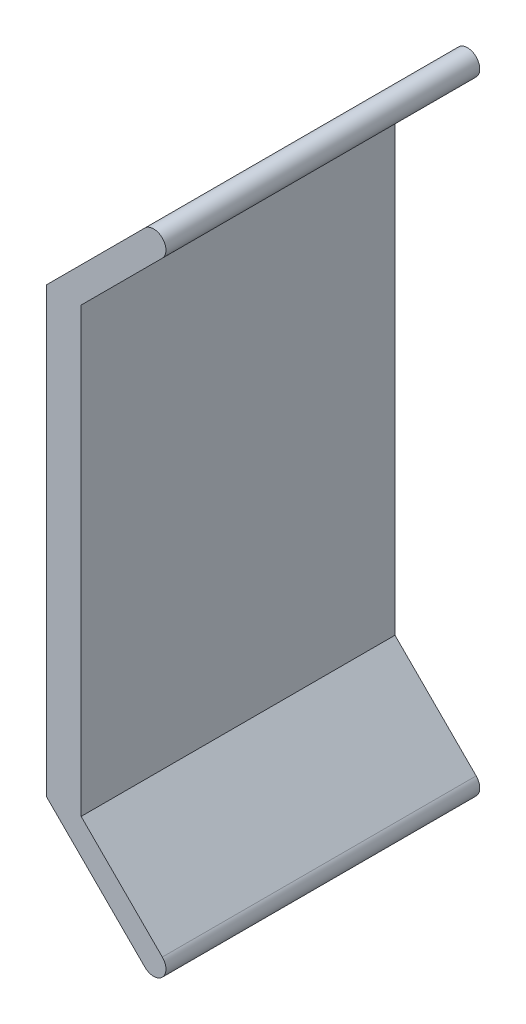
ISO-10303-21;
HEADER;
FILE_DESCRIPTION(('STEP AP214'),'2;1');
FILE_NAME('part.step','',(''),(''),'','','');
FILE_SCHEMA(('AUTOMOTIVE_DESIGN { 1 0 10303 214 1 1 1 1 }'));
ENDSEC;
DATA;
#1=APPLICATION_CONTEXT('core data for automotive mechanical design processes');
#2=APPLICATION_PROTOCOL_DEFINITION('international standard','automotive_design',2000,#1);
#3=PRODUCT_CONTEXT('',#1,'mechanical');
#4=PRODUCT('Part','Part','',(#3));
#5=PRODUCT_RELATED_PRODUCT_CATEGORY('part','',(#4));
#6=PRODUCT_DEFINITION_FORMATION('','',#4);
#7=PRODUCT_DEFINITION_CONTEXT('part definition',#1,'design');
#8=PRODUCT_DEFINITION('design','',#6,#7);
#9=PRODUCT_DEFINITION_SHAPE('','',#8);
#10=(LENGTH_UNIT() NAMED_UNIT(*) SI_UNIT(.MILLI.,.METRE.));
#11=(NAMED_UNIT(*) PLANE_ANGLE_UNIT() SI_UNIT($,.RADIAN.));
#12=(NAMED_UNIT(*) SI_UNIT($,.STERADIAN.) SOLID_ANGLE_UNIT());
#13=UNCERTAINTY_MEASURE_WITH_UNIT(LENGTH_MEASURE(1.E-05),#10,'distance_accuracy_value','');
#14=(GEOMETRIC_REPRESENTATION_CONTEXT(3) GLOBAL_UNCERTAINTY_ASSIGNED_CONTEXT((#13)) GLOBAL_UNIT_ASSIGNED_CONTEXT((#10,
#11,#12)) REPRESENTATION_CONTEXT('',''));
#15=CARTESIAN_POINT('',(0.,0.,0.));
#16=DIRECTION('',(0.,0.,1.));
#17=DIRECTION('',(1.,0.,0.));
#18=AXIS2_PLACEMENT_3D('',#15,#16,#17);
#19=CARTESIAN_POINT('',(9.14213562373107,45.8921356237311,50.));
#20=DIRECTION('',(0.707106781186548,-0.707106781186548,0.));
#21=DIRECTION('',(0.707106781186548,0.707106781186548,0.));
#22=AXIS2_PLACEMENT_3D('',#19,#20,#21);
#23=PLANE('',#22);
#24=DIRECTION('',(0.707106781186548,0.707106781186547,0.));
#25=VECTOR('',#24,1.);
#26=CARTESIAN_POINT('',(-4.99999999999997,31.75,5.));
#27=LINE('',#26,#25);
#28=CARTESIAN_POINT('',(-4.99999999999997,31.75,5.));
#29=VERTEX_POINT('',#28);
#30=CARTESIAN_POINT('',(9.14213562373107,45.8921356237311,5.));
#31=VERTEX_POINT('',#30);
#32=EDGE_CURVE('E51',#29,#31,#27,.T.);
#33=ORIENTED_EDGE('',*,*,#32,.F.);
#34=DIRECTION('',(0.,0.,-1.));
#35=VECTOR('',#34,1.);
#36=CARTESIAN_POINT('',(-4.99999999999997,31.75,50.));
#37=LINE('',#36,#35);
#38=CARTESIAN_POINT('',(-4.99999999999997,31.75,50.));
#39=VERTEX_POINT('',#38);
#40=EDGE_CURVE('E11',#39,#29,#37,.T.);
#41=ORIENTED_EDGE('',*,*,#40,.F.);
#42=DIRECTION('',(-0.707106781186548,-0.707106781186548,0.));
#43=VECTOR('',#42,1.);
#44=CARTESIAN_POINT('',(9.14213562373107,45.8921356237311,50.));
#45=LINE('',#44,#43);
#46=CARTESIAN_POINT('',(9.14213562373107,45.8921356237311,50.));
#47=VERTEX_POINT('',#46);
#48=EDGE_CURVE('E119',#47,#39,#45,.T.);
#49=ORIENTED_EDGE('',*,*,#48,.F.);
#50=DIRECTION('',(0.,0.,-1.));
#51=VECTOR('',#50,1.);
#52=CARTESIAN_POINT('',(9.14213562373107,45.8921356237311,50.));
#53=LINE('',#52,#51);
#54=EDGE_CURVE('E112',#47,#31,#53,.T.);
#55=ORIENTED_EDGE('',*,*,#54,.T.);
#56=EDGE_LOOP('',(#33,#41,#49,#55));
#57=FACE_BOUND('',#56,.T.);
#58=ADVANCED_FACE('F37',(#57),#23,.F.);
#59=CARTESIAN_POINT('',(-4.99999999999997,31.75,50.));
#60=DIRECTION('',(1.,0.,0.));
#61=DIRECTION('',(0.,0.,-1.));
#62=AXIS2_PLACEMENT_3D('',#59,#60,#61);
#63=PLANE('',#62);
#64=DIRECTION('',(0.,1.,0.));
#65=VECTOR('',#64,1.);
#66=CARTESIAN_POINT('',(-4.99999999999997,-31.7499999999999,5.));
#67=LINE('',#66,#65);
#68=CARTESIAN_POINT('',(-4.99999999999997,-31.7499999999999,5.));
#69=VERTEX_POINT('',#68);
#70=EDGE_CURVE('E100',#69,#29,#67,.T.);
#71=ORIENTED_EDGE('',*,*,#70,.F.);
#72=DIRECTION('',(0.,0.,-1.));
#73=VECTOR('',#72,1.);
#74=CARTESIAN_POINT('',(-4.99999999999997,-31.7499999999999,50.));
#75=LINE('',#74,#73);
#76=CARTESIAN_POINT('',(-4.99999999999997,-31.7499999999999,50.));
#77=VERTEX_POINT('',#76);
#78=EDGE_CURVE('E44',#77,#69,#75,.T.);
#79=ORIENTED_EDGE('',*,*,#78,.F.);
#80=DIRECTION('',(0.,-1.,0.));
#81=VECTOR('',#80,1.);
#82=CARTESIAN_POINT('',(-4.99999999999997,31.75,50.));
#83=LINE('',#82,#81);
#84=EDGE_CURVE('E116',#39,#77,#83,.T.);
#85=ORIENTED_EDGE('',*,*,#84,.F.);
#86=ORIENTED_EDGE('',*,*,#40,.T.);
#87=EDGE_LOOP('',(#71,#79,#85,#86));
#88=FACE_BOUND('',#87,.T.);
#89=ADVANCED_FACE('F115',(#88),#63,.F.);
#90=CARTESIAN_POINT('',(-4.99999999999997,-31.7499999999999,50.));
#91=DIRECTION('',(0.707106781186548,0.707106781186548,0.));
#92=DIRECTION('',(-0.707106781186548,0.707106781186548,0.));
#93=AXIS2_PLACEMENT_3D('',#90,#91,#92);
#94=PLANE('',#93);
#95=DIRECTION('',(-0.707106781186548,0.707106781186547,0.));
#96=VECTOR('',#95,1.);
#97=CARTESIAN_POINT('',(9.14213562373105,-45.8921356237309,5.));
#98=LINE('',#97,#96);
#99=CARTESIAN_POINT('',(9.14213562373105,-45.8921356237309,5.));
#100=VERTEX_POINT('',#99);
#101=EDGE_CURVE('E103',#100,#69,#98,.T.);
#102=ORIENTED_EDGE('',*,*,#101,.F.);
#103=DIRECTION('',(0.,0.,-1.));
#104=VECTOR('',#103,1.);
#105=CARTESIAN_POINT('',(9.14213562373105,-45.8921356237309,50.));
#106=LINE('',#105,#104);
#107=CARTESIAN_POINT('',(9.14213562373105,-45.8921356237309,50.));
#108=VERTEX_POINT('',#107);
#109=EDGE_CURVE('E150',#108,#100,#106,.T.);
#110=ORIENTED_EDGE('',*,*,#109,.F.);
#111=DIRECTION('',(0.707106781186548,-0.707106781186548,0.));
#112=VECTOR('',#111,1.);
#113=CARTESIAN_POINT('',(-4.99999999999997,-31.7499999999999,50.));
#114=LINE('',#113,#112);
#115=EDGE_CURVE('E118',#77,#108,#114,.T.);
#116=ORIENTED_EDGE('',*,*,#115,.F.);
#117=ORIENTED_EDGE('',*,*,#78,.T.);
#118=EDGE_LOOP('',(#102,#110,#116,#117));
#119=FACE_BOUND('',#118,.T.);
#120=ADVANCED_FACE('F153',(#119),#94,.F.);
#121=CARTESIAN_POINT('',(10.392135623731,-44.642135623731,50.));
#122=DIRECTION('',(0.,0.,-1.));
#123=DIRECTION('',(-1.,0.,0.));
#124=AXIS2_PLACEMENT_3D('',#121,#122,#123);
#125=CYLINDRICAL_SURFACE('',#124,1.76776695296631);
#126=CARTESIAN_POINT('',(10.392135623731,-44.642135623731,5.));
#127=DIRECTION('',(0.,0.,-1.));
#128=DIRECTION('',(-1.,0.,0.));
#129=AXIS2_PLACEMENT_3D('',#126,#127,#128);
#130=CIRCLE('',#129,1.7677669529663);
#131=CARTESIAN_POINT('',(11.642135623731,-43.392135623731,5.));
#132=VERTEX_POINT('',#131);
#133=EDGE_CURVE('E123',#132,#100,#130,.T.);
#134=ORIENTED_EDGE('',*,*,#133,.F.);
#135=DIRECTION('',(0.,0.,-1.));
#136=VECTOR('',#135,1.);
#137=CARTESIAN_POINT('',(11.642135623731,-43.392135623731,50.));
#138=LINE('',#137,#136);
#139=CARTESIAN_POINT('',(11.642135623731,-43.392135623731,50.));
#140=VERTEX_POINT('',#139);
#141=EDGE_CURVE('E147',#140,#132,#138,.T.);
#142=ORIENTED_EDGE('',*,*,#141,.F.);
#143=CARTESIAN_POINT('',(10.392135623731,-44.642135623731,50.));
#144=DIRECTION('',(0.,0.,1.));
#145=DIRECTION('',(1.,0.,0.));
#146=AXIS2_PLACEMENT_3D('',#143,#144,#145);
#147=CIRCLE('',#146,1.76776695296631);
#148=EDGE_CURVE('E128',#108,#140,#147,.T.);
#149=ORIENTED_EDGE('',*,*,#148,.F.);
#150=ORIENTED_EDGE('',*,*,#109,.T.);
#151=EDGE_LOOP('',(#134,#142,#149,#150));
#152=FACE_BOUND('',#151,.T.);
#153=ADVANCED_FACE('F161',(#152),#125,.T.);
#154=CARTESIAN_POINT('',(11.642135623731,-43.392135623731,50.));
#155=DIRECTION('',(-0.707106781186548,-0.707106781186548,0.));
#156=DIRECTION('',(0.707106781186548,-0.707106781186548,0.));
#157=AXIS2_PLACEMENT_3D('',#154,#155,#156);
#158=PLANE('',#157);
#159=DIRECTION('',(0.707106781186548,-0.707106781186548,0.));
#160=VECTOR('',#159,1.);
#161=CARTESIAN_POINT('',(0.,-31.7500000000001,5.));
#162=LINE('',#161,#160);
#163=CARTESIAN_POINT('',(0.,-31.7500000000001,5.));
#164=VERTEX_POINT('',#163);
#165=EDGE_CURVE('E166',#164,#132,#162,.T.);
#166=ORIENTED_EDGE('',*,*,#165,.F.);
#167=DIRECTION('',(0.,0.,-1.));
#168=VECTOR('',#167,1.);
#169=CARTESIAN_POINT('',(0.,-31.7500000000001,50.));
#170=LINE('',#169,#168);
#171=CARTESIAN_POINT('',(0.,-31.7500000000001,50.));
#172=VERTEX_POINT('',#171);
#173=EDGE_CURVE('E144',#172,#164,#170,.T.);
#174=ORIENTED_EDGE('',*,*,#173,.F.);
#175=DIRECTION('',(-0.707106781186548,0.707106781186548,0.));
#176=VECTOR('',#175,1.);
#177=CARTESIAN_POINT('',(11.642135623731,-43.392135623731,50.));
#178=LINE('',#177,#176);
#179=EDGE_CURVE('E130',#140,#172,#178,.T.);
#180=ORIENTED_EDGE('',*,*,#179,.F.);
#181=ORIENTED_EDGE('',*,*,#141,.T.);
#182=EDGE_LOOP('',(#166,#174,#180,#181));
#183=FACE_BOUND('',#182,.T.);
#184=ADVANCED_FACE('F164',(#183),#158,.F.);
#185=CARTESIAN_POINT('',(0.,-31.7500000000001,50.));
#186=DIRECTION('',(-1.,0.,0.));
#187=DIRECTION('',(0.,-1.,0.));
#188=AXIS2_PLACEMENT_3D('',#185,#186,#187);
#189=PLANE('',#188);
#190=DIRECTION('',(0.,-1.,0.));
#191=VECTOR('',#190,1.);
#192=CARTESIAN_POINT('',(0.,31.7500000000001,5.));
#193=LINE('',#192,#191);
#194=CARTESIAN_POINT('',(0.,31.7500000000001,5.));
#195=VERTEX_POINT('',#194);
#196=EDGE_CURVE('E180',#195,#164,#193,.T.);
#197=ORIENTED_EDGE('',*,*,#196,.F.);
#198=DIRECTION('',(0.,0.,-1.));
#199=VECTOR('',#198,1.);
#200=CARTESIAN_POINT('',(0.,31.7500000000001,50.));
#201=LINE('',#200,#199);
#202=CARTESIAN_POINT('',(0.,31.7500000000001,50.));
#203=VERTEX_POINT('',#202);
#204=EDGE_CURVE('E141',#203,#195,#201,.T.);
#205=ORIENTED_EDGE('',*,*,#204,.F.);
#206=DIRECTION('',(0.,1.,0.));
#207=VECTOR('',#206,1.);
#208=CARTESIAN_POINT('',(0.,-31.7500000000001,50.));
#209=LINE('',#208,#207);
#210=EDGE_CURVE('E132',#172,#203,#209,.T.);
#211=ORIENTED_EDGE('',*,*,#210,.F.);
#212=ORIENTED_EDGE('',*,*,#173,.T.);
#213=EDGE_LOOP('',(#197,#205,#211,#212));
#214=FACE_BOUND('',#213,.T.);
#215=ADVANCED_FACE('F170',(#214),#189,.F.);
#216=CARTESIAN_POINT('',(0.,31.7500000000001,50.));
#217=DIRECTION('',(-0.707106781186547,0.707106781186547,0.));
#218=DIRECTION('',(-0.707106781186548,-0.707106781186548,0.));
#219=AXIS2_PLACEMENT_3D('',#216,#217,#218);
#220=PLANE('',#219);
#221=DIRECTION('',(-0.707106781186548,-0.707106781186547,0.));
#222=VECTOR('',#221,1.);
#223=CARTESIAN_POINT('',(11.642135623731,43.3921356237311,5.));
#224=LINE('',#223,#222);
#225=CARTESIAN_POINT('',(11.642135623731,43.3921356237311,5.));
#226=VERTEX_POINT('',#225);
#227=EDGE_CURVE('E176',#226,#195,#224,.T.);
#228=ORIENTED_EDGE('',*,*,#227,.F.);
#229=DIRECTION('',(0.,0.,-1.));
#230=VECTOR('',#229,1.);
#231=CARTESIAN_POINT('',(11.642135623731,43.3921356237311,50.));
#232=LINE('',#231,#230);
#233=CARTESIAN_POINT('',(11.642135623731,43.3921356237311,50.));
#234=VERTEX_POINT('',#233);
#235=EDGE_CURVE('E138',#234,#226,#232,.T.);
#236=ORIENTED_EDGE('',*,*,#235,.F.);
#237=DIRECTION('',(0.707106781186547,0.707106781186547,0.));
#238=VECTOR('',#237,1.);
#239=CARTESIAN_POINT('',(0.,31.7500000000001,50.));
#240=LINE('',#239,#238);
#241=EDGE_CURVE('E134',#203,#234,#240,.T.);
#242=ORIENTED_EDGE('',*,*,#241,.F.);
#243=ORIENTED_EDGE('',*,*,#204,.T.);
#244=EDGE_LOOP('',(#228,#236,#242,#243));
#245=FACE_BOUND('',#244,.T.);
#246=ADVANCED_FACE('F175',(#245),#220,.F.);
#247=CARTESIAN_POINT('',(10.392135623731,44.6421356237311,50.));
#248=DIRECTION('',(0.,0.,-1.));
#249=DIRECTION('',(-1.,0.,0.));
#250=AXIS2_PLACEMENT_3D('',#247,#248,#249);
#251=CYLINDRICAL_SURFACE('',#250,1.76776695296635);
#252=CARTESIAN_POINT('',(10.392135623731,44.6421356237311,5.));
#253=DIRECTION('',(0.,0.,-1.));
#254=DIRECTION('',(-1.,0.,0.));
#255=AXIS2_PLACEMENT_3D('',#252,#253,#254);
#256=CIRCLE('',#255,1.76776695296635);
#257=EDGE_CURVE('E113',#31,#226,#256,.T.);
#258=ORIENTED_EDGE('',*,*,#257,.F.);
#259=ORIENTED_EDGE('',*,*,#54,.F.);
#260=CARTESIAN_POINT('',(10.392135623731,44.6421356237311,50.));
#261=DIRECTION('',(0.,0.,1.));
#262=DIRECTION('',(1.,0.,0.));
#263=AXIS2_PLACEMENT_3D('',#260,#261,#262);
#264=CIRCLE('',#263,1.76776695296635);
#265=EDGE_CURVE('E59',#234,#47,#264,.T.);
#266=ORIENTED_EDGE('',*,*,#265,.F.);
#267=ORIENTED_EDGE('',*,*,#235,.T.);
#268=EDGE_LOOP('',(#258,#259,#266,#267));
#269=FACE_BOUND('',#268,.T.);
#270=ADVANCED_FACE('F178',(#269),#251,.T.);
#271=CARTESIAN_POINT('',(10.392135623731,-44.642135623731,50.));
#272=DIRECTION('',(0.,0.,1.));
#273=DIRECTION('',(1.,0.,0.));
#274=AXIS2_PLACEMENT_3D('',#271,#272,#273);
#275=PLANE('',#274);
#276=ORIENTED_EDGE('',*,*,#48,.T.);
#277=ORIENTED_EDGE('',*,*,#84,.T.);
#278=ORIENTED_EDGE('',*,*,#115,.T.);
#279=ORIENTED_EDGE('',*,*,#148,.T.);
#280=ORIENTED_EDGE('',*,*,#179,.T.);
#281=ORIENTED_EDGE('',*,*,#210,.T.);
#282=ORIENTED_EDGE('',*,*,#241,.T.);
#283=ORIENTED_EDGE('',*,*,#265,.T.);
#284=EDGE_LOOP('',(#276,#277,#278,#279,#280,#281,#282,#283));
#285=FACE_BOUND('',#284,.T.);
#286=ADVANCED_FACE('F121',(#285),#275,.T.);
#287=CARTESIAN_POINT('',(10.392135623731,44.6421356237311,5.));
#288=DIRECTION('',(0.,0.,-1.));
#289=DIRECTION('',(-1.,0.,0.));
#290=AXIS2_PLACEMENT_3D('',#287,#288,#289);
#291=PLANE('',#290);
#292=ORIENTED_EDGE('',*,*,#70,.T.);
#293=ORIENTED_EDGE('',*,*,#32,.T.);
#294=ORIENTED_EDGE('',*,*,#257,.T.);
#295=ORIENTED_EDGE('',*,*,#227,.T.);
#296=ORIENTED_EDGE('',*,*,#196,.T.);
#297=ORIENTED_EDGE('',*,*,#165,.T.);
#298=ORIENTED_EDGE('',*,*,#133,.T.);
#299=ORIENTED_EDGE('',*,*,#101,.T.);
#300=EDGE_LOOP('',(#292,#293,#294,#295,#296,#297,#298,#299));
#301=FACE_BOUND('',#300,.T.);
#302=ADVANCED_FACE('F101',(#301),#291,.T.);
#303=CLOSED_SHELL('',(#58,#89,#120,#153,#184,#215,#246,#270,#286,#302));
#304=MANIFOLD_SOLID_BREP('B2',#303);
#305=ADVANCED_BREP_SHAPE_REPRESENTATION('',(#18,#304),#14);
#306=SHAPE_DEFINITION_REPRESENTATION(#9,#305);
ENDSEC;
END-ISO-10303-21;
